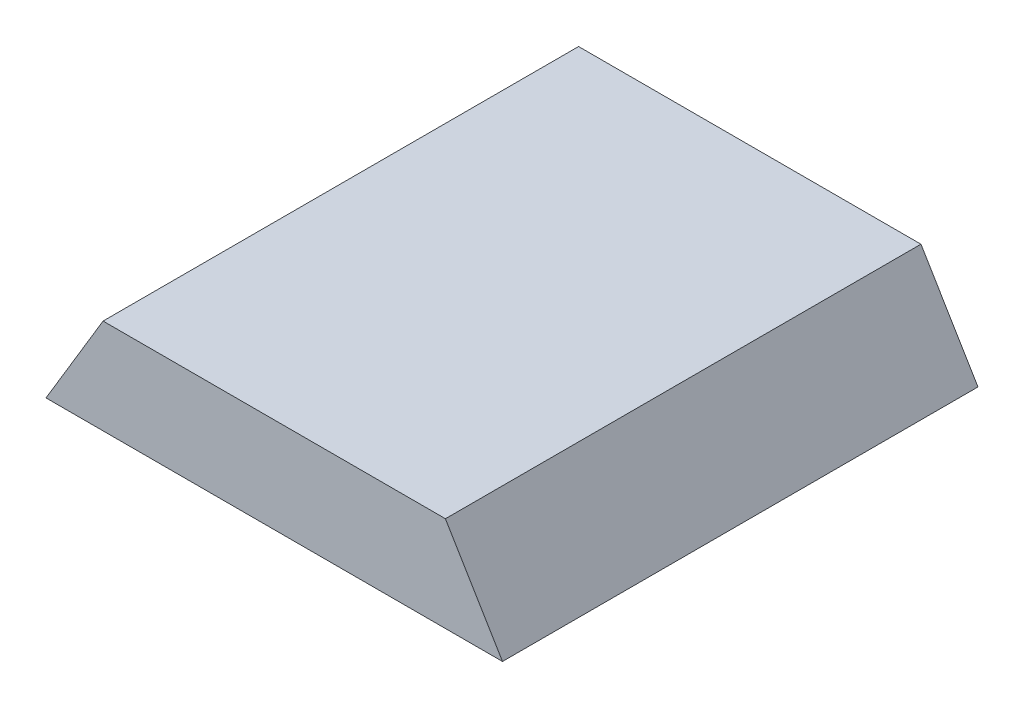
ISO-10303-21;
HEADER;
FILE_DESCRIPTION(('STEP AP214'),'2;1');
FILE_NAME('part.step','',(''),(''),'','','');
FILE_SCHEMA(('AUTOMOTIVE_DESIGN { 1 0 10303 214 1 1 1 1 }'));
ENDSEC;
DATA;
#1=APPLICATION_CONTEXT('core data for automotive mechanical design processes');
#2=APPLICATION_PROTOCOL_DEFINITION('international standard','automotive_design',2000,#1);
#3=PRODUCT_CONTEXT('',#1,'mechanical');
#4=PRODUCT('Part','Part','',(#3));
#5=PRODUCT_RELATED_PRODUCT_CATEGORY('part','',(#4));
#6=PRODUCT_DEFINITION_FORMATION('','',#4);
#7=PRODUCT_DEFINITION_CONTEXT('part definition',#1,'design');
#8=PRODUCT_DEFINITION('design','',#6,#7);
#9=PRODUCT_DEFINITION_SHAPE('','',#8);
#10=(LENGTH_UNIT() NAMED_UNIT(*) SI_UNIT(.MILLI.,.METRE.));
#11=(NAMED_UNIT(*) PLANE_ANGLE_UNIT() SI_UNIT($,.RADIAN.));
#12=(NAMED_UNIT(*) SI_UNIT($,.STERADIAN.) SOLID_ANGLE_UNIT());
#13=UNCERTAINTY_MEASURE_WITH_UNIT(LENGTH_MEASURE(1.E-05),#10,'distance_accuracy_value','');
#14=(GEOMETRIC_REPRESENTATION_CONTEXT(3) GLOBAL_UNCERTAINTY_ASSIGNED_CONTEXT((#13)) GLOBAL_UNIT_ASSIGNED_CONTEXT((#10,
#11,#12)) REPRESENTATION_CONTEXT('',''));
#15=CARTESIAN_POINT('',(0.,0.,0.));
#16=DIRECTION('',(0.,0.,1.));
#17=DIRECTION('',(1.,0.,0.));
#18=AXIS2_PLACEMENT_3D('',#15,#16,#17);
#19=CARTESIAN_POINT('',(120.,0.,-250.));
#20=DIRECTION('',(0.857492925712544,0.514495755427528,0.));
#21=DIRECTION('',(-0.514495755427528,0.857492925712544,0.));
#22=AXIS2_PLACEMENT_3D('',#19,#20,#21);
#23=PLANE('',#22);
#24=DIRECTION('',(-0.514495755427528,0.857492925712544,0.));
#25=VECTOR('',#24,1.);
#26=CARTESIAN_POINT('',(120.,0.,0.));
#27=LINE('',#26,#25);
#28=CARTESIAN_POINT('',(120.,0.,0.));
#29=VERTEX_POINT('',#28);
#30=CARTESIAN_POINT('',(90.,50.,0.));
#31=VERTEX_POINT('',#30);
#32=EDGE_CURVE('E110',#29,#31,#27,.T.);
#33=ORIENTED_EDGE('',*,*,#32,.F.);
#34=DIRECTION('',(0.,0.,1.));
#35=VECTOR('',#34,1.);
#36=CARTESIAN_POINT('',(120.,0.,-250.));
#37=LINE('',#36,#35);
#38=CARTESIAN_POINT('',(120.,0.,-250.));
#39=VERTEX_POINT('',#38);
#40=EDGE_CURVE('E11',#39,#29,#37,.T.);
#41=ORIENTED_EDGE('',*,*,#40,.F.);
#42=DIRECTION('',(-0.514495755427528,0.857492925712544,0.));
#43=VECTOR('',#42,1.);
#44=CARTESIAN_POINT('',(120.,0.,-250.));
#45=LINE('',#44,#43);
#46=CARTESIAN_POINT('',(90.,50.,-250.));
#47=VERTEX_POINT('',#46);
#48=EDGE_CURVE('E101',#39,#47,#45,.T.);
#49=ORIENTED_EDGE('',*,*,#48,.T.);
#50=DIRECTION('',(0.,0.,1.));
#51=VECTOR('',#50,1.);
#52=CARTESIAN_POINT('',(90.,50.,-250.));
#53=LINE('',#52,#51);
#54=EDGE_CURVE('E42',#47,#31,#53,.T.);
#55=ORIENTED_EDGE('',*,*,#54,.T.);
#56=EDGE_LOOP('',(#33,#41,#49,#55));
#57=FACE_BOUND('',#56,.T.);
#58=ADVANCED_FACE('F39',(#57),#23,.T.);
#59=CARTESIAN_POINT('',(-120.,0.,-250.));
#60=DIRECTION('',(0.,-1.,0.));
#61=DIRECTION('',(0.,0.,-1.));
#62=AXIS2_PLACEMENT_3D('',#59,#60,#61);
#63=PLANE('',#62);
#64=CARTESIAN_POINT('',(0.,0.,-120.));
#65=DIRECTION('',(0.,-1.,0.));
#66=DIRECTION('',(0.,0.,-1.));
#67=AXIS2_PLACEMENT_3D('',#64,#65,#66);
#68=CIRCLE('',#67,7.50000000000001);
#69=CARTESIAN_POINT('',(0.,0.,-127.5));
#70=VERTEX_POINT('',#69);
#71=EDGE_CURVE('E159',#70,#70,#68,.T.);
#72=ORIENTED_EDGE('',*,*,#71,.F.);
#73=EDGE_LOOP('',(#72));
#74=FACE_BOUND('',#73,.T.);
#75=DIRECTION('',(1.,0.,0.));
#76=VECTOR('',#75,1.);
#77=CARTESIAN_POINT('',(-120.,0.,0.));
#78=LINE('',#77,#76);
#79=CARTESIAN_POINT('',(-120.,0.,0.));
#80=VERTEX_POINT('',#79);
#81=EDGE_CURVE('E104',#80,#29,#78,.T.);
#82=ORIENTED_EDGE('',*,*,#81,.F.);
#83=DIRECTION('',(0.,0.,1.));
#84=VECTOR('',#83,1.);
#85=CARTESIAN_POINT('',(-120.,0.,-250.));
#86=LINE('',#85,#84);
#87=CARTESIAN_POINT('',(-120.,0.,-250.));
#88=VERTEX_POINT('',#87);
#89=EDGE_CURVE('E49',#88,#80,#86,.T.);
#90=ORIENTED_EDGE('',*,*,#89,.F.);
#91=DIRECTION('',(1.,0.,0.));
#92=VECTOR('',#91,1.);
#93=CARTESIAN_POINT('',(-120.,0.,-250.));
#94=LINE('',#93,#92);
#95=EDGE_CURVE('E96',#88,#39,#94,.T.);
#96=ORIENTED_EDGE('',*,*,#95,.T.);
#97=ORIENTED_EDGE('',*,*,#40,.T.);
#98=EDGE_LOOP('',(#82,#90,#96,#97));
#99=FACE_BOUND('',#98,.T.);
#100=ADVANCED_FACE('F127',(#74,#99),#63,.T.);
#101=CARTESIAN_POINT('',(-90.,50.,-250.));
#102=DIRECTION('',(-0.857492925712544,0.514495755427528,0.));
#103=DIRECTION('',(-0.514495755427528,-0.857492925712544,0.));
#104=AXIS2_PLACEMENT_3D('',#101,#102,#103);
#105=PLANE('',#104);
#106=DIRECTION('',(-0.514495755427528,-0.857492925712544,0.));
#107=VECTOR('',#106,1.);
#108=CARTESIAN_POINT('',(-90.,50.,0.));
#109=LINE('',#108,#107);
#110=CARTESIAN_POINT('',(-90.,50.,0.));
#111=VERTEX_POINT('',#110);
#112=EDGE_CURVE('E90',#111,#80,#109,.T.);
#113=ORIENTED_EDGE('',*,*,#112,.F.);
#114=DIRECTION('',(0.,0.,1.));
#115=VECTOR('',#114,1.);
#116=CARTESIAN_POINT('',(-90.,50.,-250.));
#117=LINE('',#116,#115);
#118=CARTESIAN_POINT('',(-90.,50.,-250.));
#119=VERTEX_POINT('',#118);
#120=EDGE_CURVE('E85',#119,#111,#117,.T.);
#121=ORIENTED_EDGE('',*,*,#120,.F.);
#122=DIRECTION('',(-0.514495755427528,-0.857492925712544,0.));
#123=VECTOR('',#122,1.);
#124=CARTESIAN_POINT('',(-90.,50.,-250.));
#125=LINE('',#124,#123);
#126=EDGE_CURVE('E88',#119,#88,#125,.T.);
#127=ORIENTED_EDGE('',*,*,#126,.T.);
#128=ORIENTED_EDGE('',*,*,#89,.T.);
#129=EDGE_LOOP('',(#113,#121,#127,#128));
#130=FACE_BOUND('',#129,.T.);
#131=ADVANCED_FACE('F87',(#130),#105,.T.);
#132=CARTESIAN_POINT('',(90.,50.,-250.));
#133=DIRECTION('',(0.,1.,0.));
#134=DIRECTION('',(0.,0.,1.));
#135=AXIS2_PLACEMENT_3D('',#132,#133,#134);
#136=PLANE('',#135);
#137=DIRECTION('',(-1.,0.,0.));
#138=VECTOR('',#137,1.);
#139=CARTESIAN_POINT('',(90.,50.,0.));
#140=LINE('',#139,#138);
#141=EDGE_CURVE('E114',#31,#111,#140,.T.);
#142=ORIENTED_EDGE('',*,*,#141,.F.);
#143=ORIENTED_EDGE('',*,*,#54,.F.);
#144=DIRECTION('',(-1.,0.,0.));
#145=VECTOR('',#144,1.);
#146=CARTESIAN_POINT('',(90.,50.,-250.));
#147=LINE('',#146,#145);
#148=EDGE_CURVE('E95',#47,#119,#147,.T.);
#149=ORIENTED_EDGE('',*,*,#148,.T.);
#150=ORIENTED_EDGE('',*,*,#120,.T.);
#151=EDGE_LOOP('',(#142,#143,#149,#150));
#152=FACE_BOUND('',#151,.T.);
#153=ADVANCED_FACE('F99',(#152),#136,.T.);
#154=CARTESIAN_POINT('',(0.,0.,-250.));
#155=DIRECTION('',(0.,0.,1.));
#156=DIRECTION('',(1.,0.,0.));
#157=AXIS2_PLACEMENT_3D('',#154,#155,#156);
#158=PLANE('',#157);
#159=ORIENTED_EDGE('',*,*,#48,.F.);
#160=ORIENTED_EDGE('',*,*,#95,.F.);
#161=ORIENTED_EDGE('',*,*,#126,.F.);
#162=ORIENTED_EDGE('',*,*,#148,.F.);
#163=EDGE_LOOP('',(#159,#160,#161,#162));
#164=FACE_BOUND('',#163,.T.);
#165=ADVANCED_FACE('F94',(#164),#158,.F.);
#166=CARTESIAN_POINT('',(0.,0.,0.));
#167=DIRECTION('',(0.,0.,1.));
#168=DIRECTION('',(1.,0.,0.));
#169=AXIS2_PLACEMENT_3D('',#166,#167,#168);
#170=PLANE('',#169);
#171=ORIENTED_EDGE('',*,*,#32,.T.);
#172=ORIENTED_EDGE('',*,*,#141,.T.);
#173=ORIENTED_EDGE('',*,*,#112,.T.);
#174=ORIENTED_EDGE('',*,*,#81,.T.);
#175=EDGE_LOOP('',(#171,#172,#173,#174));
#176=FACE_BOUND('',#175,.T.);
#177=ADVANCED_FACE('F126',(#176),#170,.T.);
#178=CARTESIAN_POINT('',(0.,10.,-120.));
#179=DIRECTION('',(0.,-1.,0.));
#180=DIRECTION('',(0.,0.,-1.));
#181=AXIS2_PLACEMENT_3D('',#178,#179,#180);
#182=CYLINDRICAL_SURFACE('',#181,7.50000000000001);
#183=CARTESIAN_POINT('',(0.,10.,-120.));
#184=DIRECTION('',(0.,-1.,0.));
#185=DIRECTION('',(0.,0.,-1.));
#186=AXIS2_PLACEMENT_3D('',#183,#184,#185);
#187=CIRCLE('',#186,7.50000000000001);
#188=CARTESIAN_POINT('',(0.,10.,-127.5));
#189=VERTEX_POINT('',#188);
#190=EDGE_CURVE('E115',#189,#189,#187,.T.);
#191=ORIENTED_EDGE('',*,*,#190,.F.);
#192=EDGE_LOOP('',(#191));
#193=FACE_BOUND('',#192,.T.);
#194=ORIENTED_EDGE('',*,*,#71,.T.);
#195=EDGE_LOOP('',(#194));
#196=FACE_BOUND('',#195,.T.);
#197=ADVANCED_FACE('F146',(#193,#196),#182,.F.);
#198=CARTESIAN_POINT('',(0.,10.,0.));
#199=DIRECTION('',(0.,-1.,0.));
#200=DIRECTION('',(0.,0.,-1.));
#201=AXIS2_PLACEMENT_3D('',#198,#199,#200);
#202=PLANE('',#201);
#203=ORIENTED_EDGE('',*,*,#190,.T.);
#204=EDGE_LOOP('',(#203));
#205=FACE_BOUND('',#204,.T.);
#206=ADVANCED_FACE('F150',(#205),#202,.T.);
#207=CLOSED_SHELL('',(#58,#100,#131,#153,#165,#177,#197,#206));
#208=MANIFOLD_SOLID_BREP('B2',#207);
#209=ADVANCED_BREP_SHAPE_REPRESENTATION('',(#18,#208),#14);
#210=SHAPE_DEFINITION_REPRESENTATION(#9,#209);
ENDSEC;
END-ISO-10303-21;
